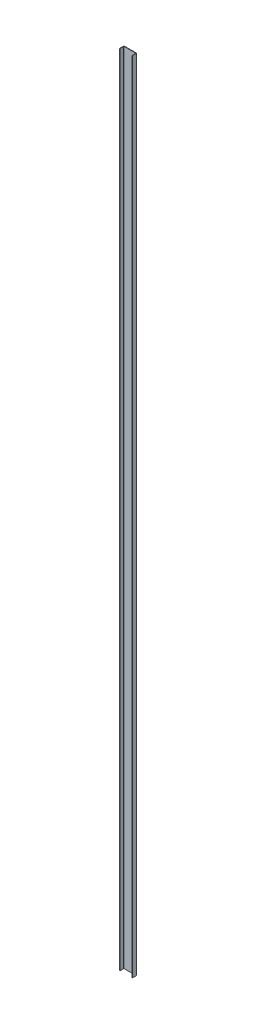
ISO-10303-21;
HEADER;
FILE_DESCRIPTION(('STEP AP214'),'2;1');
FILE_NAME('part.step','',(''),(''),'','','');
FILE_SCHEMA(('AUTOMOTIVE_DESIGN { 1 0 10303 214 1 1 1 1 }'));
ENDSEC;
DATA;
#1=APPLICATION_CONTEXT('core data for automotive mechanical design processes');
#2=APPLICATION_PROTOCOL_DEFINITION('international standard','automotive_design',2000,#1);
#3=PRODUCT_CONTEXT('',#1,'mechanical');
#4=PRODUCT('Part','Part','',(#3));
#5=PRODUCT_RELATED_PRODUCT_CATEGORY('part','',(#4));
#6=PRODUCT_DEFINITION_FORMATION('','',#4);
#7=PRODUCT_DEFINITION_CONTEXT('part definition',#1,'design');
#8=PRODUCT_DEFINITION('design','',#6,#7);
#9=PRODUCT_DEFINITION_SHAPE('','',#8);
#10=(LENGTH_UNIT() NAMED_UNIT(*) SI_UNIT(.MILLI.,.METRE.));
#11=(NAMED_UNIT(*) PLANE_ANGLE_UNIT() SI_UNIT($,.RADIAN.));
#12=(NAMED_UNIT(*) SI_UNIT($,.STERADIAN.) SOLID_ANGLE_UNIT());
#13=UNCERTAINTY_MEASURE_WITH_UNIT(LENGTH_MEASURE(1.E-05),#10,'distance_accuracy_value','');
#14=(GEOMETRIC_REPRESENTATION_CONTEXT(3) GLOBAL_UNCERTAINTY_ASSIGNED_CONTEXT((#13)) GLOBAL_UNIT_ASSIGNED_CONTEXT((#10,
#11,#12)) REPRESENTATION_CONTEXT('',''));
#15=CARTESIAN_POINT('',(0.,0.,0.));
#16=DIRECTION('',(0.,0.,1.));
#17=DIRECTION('',(1.,0.,0.));
#18=AXIS2_PLACEMENT_3D('',#15,#16,#17);
#19=CARTESIAN_POINT('',(0.,2000.,0.));
#20=DIRECTION('',(0.,0.,-1.));
#21=DIRECTION('',(-1.,0.,0.));
#22=AXIS2_PLACEMENT_3D('',#19,#20,#21);
#23=PLANE('',#22);
#24=DIRECTION('',(1.,0.,0.));
#25=VECTOR('',#24,1.);
#26=CARTESIAN_POINT('',(0.,0.,0.));
#27=LINE('',#26,#25);
#28=CARTESIAN_POINT('',(-1.,0.,0.));
#29=VERTEX_POINT('',#28);
#30=CARTESIAN_POINT('',(0.,0.,0.));
#31=VERTEX_POINT('',#30);
#32=EDGE_CURVE('E155',#29,#31,#27,.T.);
#33=ORIENTED_EDGE('',*,*,#32,.T.);
#34=DIRECTION('',(0.,-1.,0.));
#35=VECTOR('',#34,1.);
#36=CARTESIAN_POINT('',(0.,2000.,0.));
#37=LINE('',#36,#35);
#38=CARTESIAN_POINT('',(0.,2000.,0.));
#39=VERTEX_POINT('',#38);
#40=EDGE_CURVE('E136',#39,#31,#37,.T.);
#41=ORIENTED_EDGE('',*,*,#40,.F.);
#42=DIRECTION('',(1.,0.,0.));
#43=VECTOR('',#42,1.);
#44=CARTESIAN_POINT('',(0.,2000.,0.));
#45=LINE('',#44,#43);
#46=CARTESIAN_POINT('',(-1.,2000.,0.));
#47=VERTEX_POINT('',#46);
#48=EDGE_CURVE('E143',#47,#39,#45,.T.);
#49=ORIENTED_EDGE('',*,*,#48,.F.);
#50=DIRECTION('',(0.,-1.,0.));
#51=VECTOR('',#50,1.);
#52=CARTESIAN_POINT('',(-1.,2000.,0.));
#53=LINE('',#52,#51);
#54=EDGE_CURVE('E243',#47,#29,#53,.T.);
#55=ORIENTED_EDGE('',*,*,#54,.T.);
#56=EDGE_LOOP('',(#33,#41,#49,#55));
#57=FACE_BOUND('',#56,.T.);
#58=ADVANCED_FACE('F39',(#57),#23,.F.);
#59=CARTESIAN_POINT('',(0.,2000.,0.));
#60=DIRECTION('',(-1.,0.,0.));
#61=DIRECTION('',(0.,0.,1.));
#62=AXIS2_PLACEMENT_3D('',#59,#60,#61);
#63=PLANE('',#62);
#64=DIRECTION('',(0.,0.,-1.));
#65=VECTOR('',#64,1.);
#66=CARTESIAN_POINT('',(0.,0.,0.));
#67=LINE('',#66,#65);
#68=CARTESIAN_POINT('',(0.,0.,-9.));
#69=VERTEX_POINT('',#68);
#70=EDGE_CURVE('E212',#31,#69,#67,.T.);
#71=ORIENTED_EDGE('',*,*,#70,.T.);
#72=DIRECTION('',(0.,-1.,0.));
#73=VECTOR('',#72,1.);
#74=CARTESIAN_POINT('',(0.,2000.,-9.));
#75=LINE('',#74,#73);
#76=CARTESIAN_POINT('',(0.,2000.,-9.));
#77=VERTEX_POINT('',#76);
#78=EDGE_CURVE('E139',#69,#77,#75,.F.);
#79=ORIENTED_EDGE('',*,*,#78,.T.);
#80=DIRECTION('',(0.,0.,-1.));
#81=VECTOR('',#80,1.);
#82=CARTESIAN_POINT('',(0.,2000.,0.));
#83=LINE('',#82,#81);
#84=EDGE_CURVE('E131',#39,#77,#83,.T.);
#85=ORIENTED_EDGE('',*,*,#84,.F.);
#86=ORIENTED_EDGE('',*,*,#40,.T.);
#87=EDGE_LOOP('',(#71,#79,#85,#86));
#88=FACE_BOUND('',#87,.T.);
#89=ADVANCED_FACE('F134',(#88),#63,.F.);
#90=CARTESIAN_POINT('',(0.,2000.,-10.));
#91=DIRECTION('',(0.,0.,-1.));
#92=DIRECTION('',(-1.,0.,0.));
#93=AXIS2_PLACEMENT_3D('',#90,#91,#92);
#94=PLANE('',#93);
#95=DIRECTION('',(1.,0.,0.));
#96=VECTOR('',#95,1.);
#97=CARTESIAN_POINT('',(0.,0.,-10.));
#98=LINE('',#97,#96);
#99=CARTESIAN_POINT('',(1.,0.,-10.));
#100=VERTEX_POINT('',#99);
#101=CARTESIAN_POINT('',(29.,0.,-10.));
#102=VERTEX_POINT('',#101);
#103=EDGE_CURVE('E214',#100,#102,#98,.T.);
#104=ORIENTED_EDGE('',*,*,#103,.T.);
#105=DIRECTION('',(0.,-1.,0.));
#106=VECTOR('',#105,1.);
#107=CARTESIAN_POINT('',(29.,2000.,-10.));
#108=LINE('',#107,#106);
#109=CARTESIAN_POINT('',(29.,2000.,-10.));
#110=VERTEX_POINT('',#109);
#111=EDGE_CURVE('E173',#102,#110,#108,.F.);
#112=ORIENTED_EDGE('',*,*,#111,.T.);
#113=DIRECTION('',(1.,0.,0.));
#114=VECTOR('',#113,1.);
#115=CARTESIAN_POINT('',(0.,2000.,-10.));
#116=LINE('',#115,#114);
#117=CARTESIAN_POINT('',(1.,2000.,-10.));
#118=VERTEX_POINT('',#117);
#119=EDGE_CURVE('E142',#118,#110,#116,.T.);
#120=ORIENTED_EDGE('',*,*,#119,.F.);
#121=DIRECTION('',(0.,-1.,0.));
#122=VECTOR('',#121,1.);
#123=CARTESIAN_POINT('',(1.,0.,-10.));
#124=LINE('',#123,#122);
#125=EDGE_CURVE('E163',#118,#100,#124,.T.);
#126=ORIENTED_EDGE('',*,*,#125,.T.);
#127=EDGE_LOOP('',(#104,#112,#120,#126));
#128=FACE_BOUND('',#127,.T.);
#129=ADVANCED_FACE('F224',(#128),#94,.F.);
#130=CARTESIAN_POINT('',(30.,2000.,-10.));
#131=DIRECTION('',(1.,0.,0.));
#132=DIRECTION('',(0.,0.,-1.));
#133=AXIS2_PLACEMENT_3D('',#130,#131,#132);
#134=PLANE('',#133);
#135=DIRECTION('',(0.,0.,1.));
#136=VECTOR('',#135,1.);
#137=CARTESIAN_POINT('',(30.,2000.,-10.));
#138=LINE('',#137,#136);
#139=CARTESIAN_POINT('',(30.,2000.,-9.));
#140=VERTEX_POINT('',#139);
#141=CARTESIAN_POINT('',(30.,2000.,0.));
#142=VERTEX_POINT('',#141);
#143=EDGE_CURVE('E227',#140,#142,#138,.T.);
#144=ORIENTED_EDGE('',*,*,#143,.F.);
#145=DIRECTION('',(0.,-1.,0.));
#146=VECTOR('',#145,1.);
#147=CARTESIAN_POINT('',(30.,0.,-9.));
#148=LINE('',#147,#146);
#149=CARTESIAN_POINT('',(30.,0.,-9.));
#150=VERTEX_POINT('',#149);
#151=EDGE_CURVE('E157',#140,#150,#148,.T.);
#152=ORIENTED_EDGE('',*,*,#151,.T.);
#153=DIRECTION('',(0.,0.,1.));
#154=VECTOR('',#153,1.);
#155=CARTESIAN_POINT('',(30.,0.,-10.));
#156=LINE('',#155,#154);
#157=CARTESIAN_POINT('',(30.,0.,0.));
#158=VERTEX_POINT('',#157);
#159=EDGE_CURVE('E248',#150,#158,#156,.T.);
#160=ORIENTED_EDGE('',*,*,#159,.T.);
#161=DIRECTION('',(0.,-1.,0.));
#162=VECTOR('',#161,1.);
#163=CARTESIAN_POINT('',(30.,2000.,0.));
#164=LINE('',#163,#162);
#165=EDGE_CURVE('E158',#142,#158,#164,.T.);
#166=ORIENTED_EDGE('',*,*,#165,.F.);
#167=EDGE_LOOP('',(#144,#152,#160,#166));
#168=FACE_BOUND('',#167,.T.);
#169=ADVANCED_FACE('F369',(#168),#134,.F.);
#170=CARTESIAN_POINT('',(30.,2000.,0.));
#171=DIRECTION('',(0.,0.,-1.));
#172=DIRECTION('',(-1.,0.,0.));
#173=AXIS2_PLACEMENT_3D('',#170,#171,#172);
#174=PLANE('',#173);
#175=DIRECTION('',(1.,0.,0.));
#176=VECTOR('',#175,1.);
#177=CARTESIAN_POINT('',(30.,0.,0.));
#178=LINE('',#177,#176);
#179=CARTESIAN_POINT('',(31.,0.,0.));
#180=VERTEX_POINT('',#179);
#181=EDGE_CURVE('E251',#158,#180,#178,.T.);
#182=ORIENTED_EDGE('',*,*,#181,.T.);
#183=DIRECTION('',(0.,-1.,0.));
#184=VECTOR('',#183,1.);
#185=CARTESIAN_POINT('',(31.,2000.,0.));
#186=LINE('',#185,#184);
#187=CARTESIAN_POINT('',(31.,2000.,0.));
#188=VERTEX_POINT('',#187);
#189=EDGE_CURVE('E166',#188,#180,#186,.T.);
#190=ORIENTED_EDGE('',*,*,#189,.F.);
#191=DIRECTION('',(1.,0.,0.));
#192=VECTOR('',#191,1.);
#193=CARTESIAN_POINT('',(30.,2000.,0.));
#194=LINE('',#193,#192);
#195=EDGE_CURVE('E230',#142,#188,#194,.T.);
#196=ORIENTED_EDGE('',*,*,#195,.F.);
#197=ORIENTED_EDGE('',*,*,#165,.T.);
#198=EDGE_LOOP('',(#182,#190,#196,#197));
#199=FACE_BOUND('',#198,.T.);
#200=ADVANCED_FACE('F362',(#199),#174,.F.);
#201=CARTESIAN_POINT('',(31.,2000.,-11.));
#202=DIRECTION('',(-1.,0.,0.));
#203=DIRECTION('',(0.,0.,1.));
#204=AXIS2_PLACEMENT_3D('',#201,#202,#203);
#205=PLANE('',#204);
#206=DIRECTION('',(0.,0.,-1.));
#207=VECTOR('',#206,1.);
#208=CARTESIAN_POINT('',(31.,0.,-11.));
#209=LINE('',#208,#207);
#210=CARTESIAN_POINT('',(31.,0.,-10.));
#211=VERTEX_POINT('',#210);
#212=EDGE_CURVE('E254',#180,#211,#209,.T.);
#213=ORIENTED_EDGE('',*,*,#212,.T.);
#214=DIRECTION('',(0.,-1.,0.));
#215=VECTOR('',#214,1.);
#216=CARTESIAN_POINT('',(31.,2000.,-10.));
#217=LINE('',#216,#215);
#218=CARTESIAN_POINT('',(31.,2000.,-10.));
#219=VERTEX_POINT('',#218);
#220=EDGE_CURVE('E63',#211,#219,#217,.F.);
#221=ORIENTED_EDGE('',*,*,#220,.T.);
#222=DIRECTION('',(0.,0.,-1.));
#223=VECTOR('',#222,1.);
#224=CARTESIAN_POINT('',(31.,2000.,-11.));
#225=LINE('',#224,#223);
#226=EDGE_CURVE('E235',#188,#219,#225,.T.);
#227=ORIENTED_EDGE('',*,*,#226,.F.);
#228=ORIENTED_EDGE('',*,*,#189,.T.);
#229=EDGE_LOOP('',(#213,#221,#227,#228));
#230=FACE_BOUND('',#229,.T.);
#231=ADVANCED_FACE('F268',(#230),#205,.F.);
#232=CARTESIAN_POINT('',(-1.,2000.,-11.));
#233=DIRECTION('',(0.,0.,1.));
#234=DIRECTION('',(1.,0.,0.));
#235=AXIS2_PLACEMENT_3D('',#232,#233,#234);
#236=PLANE('',#235);
#237=DIRECTION('',(-1.,0.,0.));
#238=VECTOR('',#237,1.);
#239=CARTESIAN_POINT('',(-1.,2000.,-11.));
#240=LINE('',#239,#238);
#241=CARTESIAN_POINT('',(30.,2000.,-11.));
#242=VERTEX_POINT('',#241);
#243=CARTESIAN_POINT('',(0.,2000.,-11.));
#244=VERTEX_POINT('',#243);
#245=EDGE_CURVE('E238',#242,#244,#240,.T.);
#246=ORIENTED_EDGE('',*,*,#245,.F.);
#247=DIRECTION('',(0.,-1.,0.));
#248=VECTOR('',#247,1.);
#249=CARTESIAN_POINT('',(30.,2000.,-11.));
#250=LINE('',#249,#248);
#251=CARTESIAN_POINT('',(30.,0.,-11.));
#252=VERTEX_POINT('',#251);
#253=EDGE_CURVE('E181',#242,#252,#250,.T.);
#254=ORIENTED_EDGE('',*,*,#253,.T.);
#255=DIRECTION('',(-1.,0.,0.));
#256=VECTOR('',#255,1.);
#257=CARTESIAN_POINT('',(-1.,0.,-11.));
#258=LINE('',#257,#256);
#259=CARTESIAN_POINT('',(0.,0.,-11.));
#260=VERTEX_POINT('',#259);
#261=EDGE_CURVE('E257',#252,#260,#258,.T.);
#262=ORIENTED_EDGE('',*,*,#261,.T.);
#263=DIRECTION('',(0.,-1.,0.));
#264=VECTOR('',#263,1.);
#265=CARTESIAN_POINT('',(0.,2000.,-11.));
#266=LINE('',#265,#264);
#267=EDGE_CURVE('E178',#260,#244,#266,.F.);
#268=ORIENTED_EDGE('',*,*,#267,.T.);
#269=EDGE_LOOP('',(#246,#254,#262,#268));
#270=FACE_BOUND('',#269,.T.);
#271=ADVANCED_FACE('F279',(#270),#236,.F.);
#272=CARTESIAN_POINT('',(-1.,2000.,0.));
#273=DIRECTION('',(1.,0.,0.));
#274=DIRECTION('',(0.,0.,-1.));
#275=AXIS2_PLACEMENT_3D('',#272,#273,#274);
#276=PLANE('',#275);
#277=DIRECTION('',(0.,0.,1.));
#278=VECTOR('',#277,1.);
#279=CARTESIAN_POINT('',(-1.,2000.,0.));
#280=LINE('',#279,#278);
#281=CARTESIAN_POINT('',(-1.,2000.,-10.));
#282=VERTEX_POINT('',#281);
#283=EDGE_CURVE('E147',#282,#47,#280,.T.);
#284=ORIENTED_EDGE('',*,*,#283,.F.);
#285=DIRECTION('',(0.,-1.,0.));
#286=VECTOR('',#285,1.);
#287=CARTESIAN_POINT('',(-1.,2000.,-10.));
#288=LINE('',#287,#286);
#289=CARTESIAN_POINT('',(-1.,0.,-10.));
#290=VERTEX_POINT('',#289);
#291=EDGE_CURVE('E198',#282,#290,#288,.T.);
#292=ORIENTED_EDGE('',*,*,#291,.T.);
#293=DIRECTION('',(0.,0.,1.));
#294=VECTOR('',#293,1.);
#295=CARTESIAN_POINT('',(-1.,0.,0.));
#296=LINE('',#295,#294);
#297=EDGE_CURVE('E152',#290,#29,#296,.T.);
#298=ORIENTED_EDGE('',*,*,#297,.T.);
#299=ORIENTED_EDGE('',*,*,#54,.F.);
#300=EDGE_LOOP('',(#284,#292,#298,#299));
#301=FACE_BOUND('',#300,.T.);
#302=ADVANCED_FACE('F285',(#301),#276,.F.);
#303=CARTESIAN_POINT('',(0.,2000.,0.));
#304=DIRECTION('',(0.,-1.,0.));
#305=DIRECTION('',(0.,0.,-1.));
#306=AXIS2_PLACEMENT_3D('',#303,#304,#305);
#307=PLANE('',#306);
#308=ORIENTED_EDGE('',*,*,#226,.T.);
#309=CARTESIAN_POINT('',(30.,2000.,-10.));
#310=DIRECTION('',(0.,-1.,0.));
#311=DIRECTION('',(0.,0.,-1.));
#312=AXIS2_PLACEMENT_3D('',#309,#310,#311);
#313=CIRCLE('',#312,1.);
#314=EDGE_CURVE('E195',#219,#242,#313,.F.);
#315=ORIENTED_EDGE('',*,*,#314,.T.);
#316=ORIENTED_EDGE('',*,*,#245,.T.);
#317=CARTESIAN_POINT('',(0.,2000.,-10.));
#318=DIRECTION('',(0.,-1.,0.));
#319=DIRECTION('',(0.,0.,-1.));
#320=AXIS2_PLACEMENT_3D('',#317,#318,#319);
#321=CIRCLE('',#320,1.);
#322=EDGE_CURVE('E55',#244,#282,#321,.F.);
#323=ORIENTED_EDGE('',*,*,#322,.T.);
#324=ORIENTED_EDGE('',*,*,#283,.T.);
#325=ORIENTED_EDGE('',*,*,#48,.T.);
#326=ORIENTED_EDGE('',*,*,#84,.T.);
#327=CARTESIAN_POINT('',(1.,2000.,-9.));
#328=DIRECTION('',(0.,-1.,0.));
#329=DIRECTION('',(0.,0.,-1.));
#330=AXIS2_PLACEMENT_3D('',#327,#328,#329);
#331=CIRCLE('',#330,1.);
#332=EDGE_CURVE('E11',#77,#118,#331,.T.);
#333=ORIENTED_EDGE('',*,*,#332,.T.);
#334=ORIENTED_EDGE('',*,*,#119,.T.);
#335=CARTESIAN_POINT('',(29.,2000.,-9.));
#336=DIRECTION('',(0.,-1.,0.));
#337=DIRECTION('',(0.,0.,-1.));
#338=AXIS2_PLACEMENT_3D('',#335,#336,#337);
#339=CIRCLE('',#338,1.);
#340=EDGE_CURVE('E205',#110,#140,#339,.T.);
#341=ORIENTED_EDGE('',*,*,#340,.T.);
#342=ORIENTED_EDGE('',*,*,#143,.T.);
#343=ORIENTED_EDGE('',*,*,#195,.T.);
#344=EDGE_LOOP('',(#308,#315,#316,#323,#324,#325,#326,#333,#334,#341,#342,#343));
#345=FACE_BOUND('',#344,.T.);
#346=ADVANCED_FACE('F146',(#345),#307,.F.);
#347=CARTESIAN_POINT('',(0.,0.,0.));
#348=DIRECTION('',(0.,-1.,0.));
#349=DIRECTION('',(0.,0.,-1.));
#350=AXIS2_PLACEMENT_3D('',#347,#348,#349);
#351=PLANE('',#350);
#352=ORIENTED_EDGE('',*,*,#261,.F.);
#353=CARTESIAN_POINT('',(30.,0.,-10.));
#354=DIRECTION('',(0.,-1.,0.));
#355=DIRECTION('',(0.,0.,-1.));
#356=AXIS2_PLACEMENT_3D('',#353,#354,#355);
#357=CIRCLE('',#356,1.);
#358=EDGE_CURVE('E188',#252,#211,#357,.T.);
#359=ORIENTED_EDGE('',*,*,#358,.T.);
#360=ORIENTED_EDGE('',*,*,#212,.F.);
#361=ORIENTED_EDGE('',*,*,#181,.F.);
#362=ORIENTED_EDGE('',*,*,#159,.F.);
#363=CARTESIAN_POINT('',(29.,0.,-9.));
#364=DIRECTION('',(0.,-1.,0.));
#365=DIRECTION('',(0.,0.,-1.));
#366=AXIS2_PLACEMENT_3D('',#363,#364,#365);
#367=CIRCLE('',#366,1.);
#368=EDGE_CURVE('E202',#150,#102,#367,.F.);
#369=ORIENTED_EDGE('',*,*,#368,.T.);
#370=ORIENTED_EDGE('',*,*,#103,.F.);
#371=CARTESIAN_POINT('',(1.,0.,-9.));
#372=DIRECTION('',(0.,-1.,0.));
#373=DIRECTION('',(0.,0.,-1.));
#374=AXIS2_PLACEMENT_3D('',#371,#372,#373);
#375=CIRCLE('',#374,1.);
#376=EDGE_CURVE('E48',#100,#69,#375,.F.);
#377=ORIENTED_EDGE('',*,*,#376,.T.);
#378=ORIENTED_EDGE('',*,*,#70,.F.);
#379=ORIENTED_EDGE('',*,*,#32,.F.);
#380=ORIENTED_EDGE('',*,*,#297,.F.);
#381=CARTESIAN_POINT('',(0.,0.,-10.));
#382=DIRECTION('',(0.,-1.,0.));
#383=DIRECTION('',(0.,0.,-1.));
#384=AXIS2_PLACEMENT_3D('',#381,#382,#383);
#385=CIRCLE('',#384,1.);
#386=EDGE_CURVE('E185',#290,#260,#385,.T.);
#387=ORIENTED_EDGE('',*,*,#386,.T.);
#388=EDGE_LOOP('',(#352,#359,#360,#361,#362,#369,#370,#377,#378,#379,#380,#387));
#389=FACE_BOUND('',#388,.T.);
#390=ADVANCED_FACE('F211',(#389),#351,.T.);
#391=CARTESIAN_POINT('',(29.,2000.,-9.));
#392=DIRECTION('',(0.,1.,0.));
#393=DIRECTION('',(0.,0.,1.));
#394=AXIS2_PLACEMENT_3D('',#391,#392,#393);
#395=CYLINDRICAL_SURFACE('',#394,1.);
#396=ORIENTED_EDGE('',*,*,#340,.F.);
#397=ORIENTED_EDGE('',*,*,#111,.F.);
#398=ORIENTED_EDGE('',*,*,#368,.F.);
#399=ORIENTED_EDGE('',*,*,#151,.F.);
#400=EDGE_LOOP('',(#396,#397,#398,#399));
#401=FACE_BOUND('',#400,.T.);
#402=ADVANCED_FACE('F303',(#401),#395,.F.);
#403=CARTESIAN_POINT('',(1.,2000.,-9.));
#404=DIRECTION('',(0.,1.,0.));
#405=DIRECTION('',(0.,0.,1.));
#406=AXIS2_PLACEMENT_3D('',#403,#404,#405);
#407=CYLINDRICAL_SURFACE('',#406,1.);
#408=ORIENTED_EDGE('',*,*,#332,.F.);
#409=ORIENTED_EDGE('',*,*,#78,.F.);
#410=ORIENTED_EDGE('',*,*,#376,.F.);
#411=ORIENTED_EDGE('',*,*,#125,.F.);
#412=EDGE_LOOP('',(#408,#409,#410,#411));
#413=FACE_BOUND('',#412,.T.);
#414=ADVANCED_FACE('F219',(#413),#407,.F.);
#415=CARTESIAN_POINT('',(30.,2000.,-10.));
#416=DIRECTION('',(0.,-1.,0.));
#417=DIRECTION('',(0.,0.,-1.));
#418=AXIS2_PLACEMENT_3D('',#415,#416,#417);
#419=CYLINDRICAL_SURFACE('',#418,1.);
#420=ORIENTED_EDGE('',*,*,#314,.F.);
#421=ORIENTED_EDGE('',*,*,#220,.F.);
#422=ORIENTED_EDGE('',*,*,#358,.F.);
#423=ORIENTED_EDGE('',*,*,#253,.F.);
#424=EDGE_LOOP('',(#420,#421,#422,#423));
#425=FACE_BOUND('',#424,.T.);
#426=ADVANCED_FACE('F276',(#425),#419,.T.);
#427=CARTESIAN_POINT('',(0.,2000.,-10.));
#428=DIRECTION('',(0.,-1.,0.));
#429=DIRECTION('',(0.,0.,-1.));
#430=AXIS2_PLACEMENT_3D('',#427,#428,#429);
#431=CYLINDRICAL_SURFACE('',#430,1.);
#432=ORIENTED_EDGE('',*,*,#322,.F.);
#433=ORIENTED_EDGE('',*,*,#267,.F.);
#434=ORIENTED_EDGE('',*,*,#386,.F.);
#435=ORIENTED_EDGE('',*,*,#291,.F.);
#436=EDGE_LOOP('',(#432,#433,#434,#435));
#437=FACE_BOUND('',#436,.T.);
#438=ADVANCED_FACE('F41',(#437),#431,.T.);
#439=CLOSED_SHELL('',(#58,#89,#129,#169,#200,#231,#271,#302,#346,#390,#402,#414,#426,#438));
#440=MANIFOLD_SOLID_BREP('B2',#439);
#441=ADVANCED_BREP_SHAPE_REPRESENTATION('',(#18,#440),#14);
#442=SHAPE_DEFINITION_REPRESENTATION(#9,#441);
ENDSEC;
END-ISO-10303-21;
